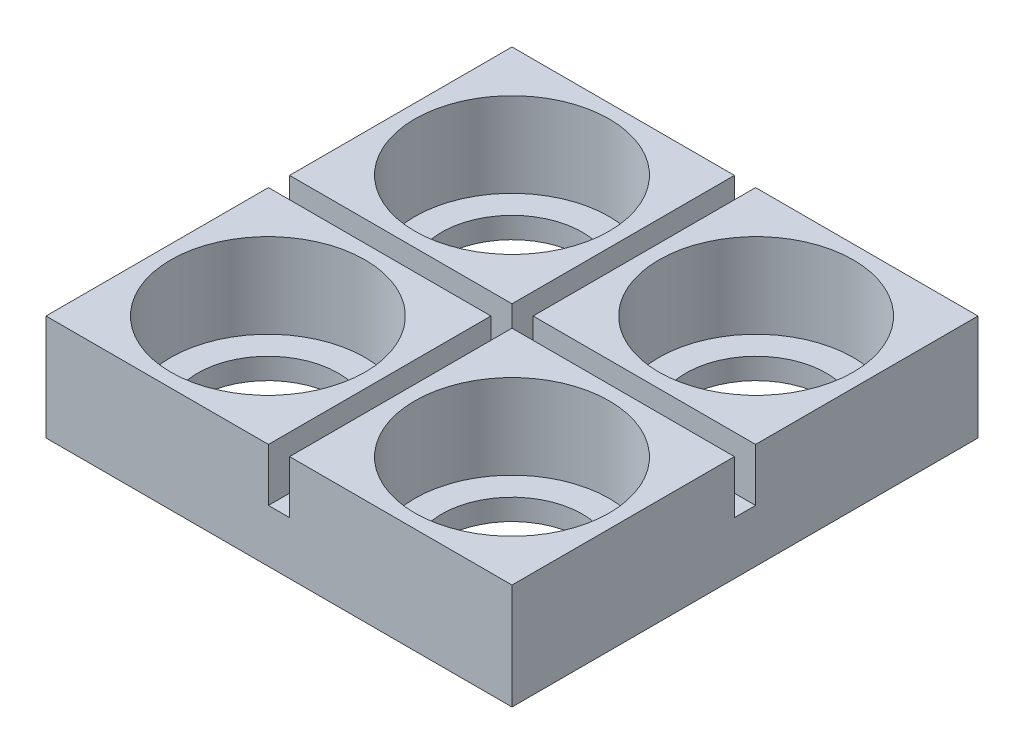
ISO-10303-21;
HEADER;
FILE_DESCRIPTION(('STEP AP214'),'2;1');
FILE_NAME('part.step','',(''),(''),'','','');
FILE_SCHEMA(('AUTOMOTIVE_DESIGN { 1 0 10303 214 1 1 1 1 }'));
ENDSEC;
DATA;
#1=APPLICATION_CONTEXT('core data for automotive mechanical design processes');
#2=APPLICATION_PROTOCOL_DEFINITION('international standard','automotive_design',2000,#1);
#3=PRODUCT_CONTEXT('',#1,'mechanical');
#4=PRODUCT('Part','Part','',(#3));
#5=PRODUCT_RELATED_PRODUCT_CATEGORY('part','',(#4));
#6=PRODUCT_DEFINITION_FORMATION('','',#4);
#7=PRODUCT_DEFINITION_CONTEXT('part definition',#1,'design');
#8=PRODUCT_DEFINITION('design','',#6,#7);
#9=PRODUCT_DEFINITION_SHAPE('','',#8);
#10=(LENGTH_UNIT() NAMED_UNIT(*) SI_UNIT(.MILLI.,.METRE.));
#11=(NAMED_UNIT(*) PLANE_ANGLE_UNIT() SI_UNIT($,.RADIAN.));
#12=(NAMED_UNIT(*) SI_UNIT($,.STERADIAN.) SOLID_ANGLE_UNIT());
#13=UNCERTAINTY_MEASURE_WITH_UNIT(LENGTH_MEASURE(1.E-05),#10,'distance_accuracy_value','');
#14=(GEOMETRIC_REPRESENTATION_CONTEXT(3) GLOBAL_UNCERTAINTY_ASSIGNED_CONTEXT((#13)) GLOBAL_UNIT_ASSIGNED_CONTEXT((#10,
#11,#12)) REPRESENTATION_CONTEXT('',''));
#15=CARTESIAN_POINT('',(0.,0.,0.));
#16=DIRECTION('',(0.,0.,1.));
#17=DIRECTION('',(1.,0.,0.));
#18=AXIS2_PLACEMENT_3D('',#15,#16,#17);
#19=CARTESIAN_POINT('',(0.,10.,0.));
#20=DIRECTION('',(0.,1.,0.));
#21=DIRECTION('',(0.,0.,1.));
#22=AXIS2_PLACEMENT_3D('',#19,#20,#21);
#23=PLANE('',#22);
#24=DIRECTION('',(0.,0.,-1.));
#25=VECTOR('',#24,1.);
#26=CARTESIAN_POINT('',(23.05,10.,-22.05));
#27=LINE('',#26,#25);
#28=CARTESIAN_POINT('',(23.05,10.,-1.00000000000001));
#29=VERTEX_POINT('',#28);
#30=CARTESIAN_POINT('',(23.05,10.,-22.05));
#31=VERTEX_POINT('',#30);
#32=EDGE_CURVE('E200',#29,#31,#27,.T.);
#33=ORIENTED_EDGE('',*,*,#32,.F.);
#34=DIRECTION('',(-1.,0.,0.));
#35=VECTOR('',#34,1.);
#36=CARTESIAN_POINT('',(0.,10.,-1.));
#37=LINE('',#36,#35);
#38=CARTESIAN_POINT('',(44.1,10.,-1.00000000000003));
#39=VERTEX_POINT('',#38);
#40=EDGE_CURVE('E13',#39,#29,#37,.T.);
#41=ORIENTED_EDGE('',*,*,#40,.F.);
#42=DIRECTION('',(0.,0.,-1.));
#43=VECTOR('',#42,1.);
#44=CARTESIAN_POINT('',(44.1,10.,-22.05));
#45=LINE('',#44,#43);
#46=CARTESIAN_POINT('',(44.1,10.,-22.05));
#47=VERTEX_POINT('',#46);
#48=EDGE_CURVE('E317',#39,#47,#45,.T.);
#49=ORIENTED_EDGE('',*,*,#48,.T.);
#50=DIRECTION('',(-1.,0.,0.));
#51=VECTOR('',#50,1.);
#52=CARTESIAN_POINT('',(0.,10.,-22.05));
#53=LINE('',#52,#51);
#54=EDGE_CURVE('E321',#47,#31,#53,.T.);
#55=ORIENTED_EDGE('',*,*,#54,.T.);
#56=EDGE_LOOP('',(#33,#41,#49,#55));
#57=FACE_BOUND('',#56,.T.);
#58=CARTESIAN_POINT('',(33.6,10.,-11.55));
#59=DIRECTION('',(0.,-1.,0.));
#60=DIRECTION('',(0.,0.,1.));
#61=AXIS2_PLACEMENT_3D('',#58,#59,#60);
#62=CIRCLE('',#61,9.19999999999999);
#63=CARTESIAN_POINT('',(33.6,10.,-2.35000000000001));
#64=VERTEX_POINT('',#63);
#65=EDGE_CURVE('E279',#64,#64,#62,.T.);
#66=ORIENTED_EDGE('',*,*,#65,.T.);
#67=EDGE_LOOP('',(#66));
#68=FACE_BOUND('',#67,.T.);
#69=ADVANCED_FACE('F55',(#57,#68),#23,.T.);
#70=DIRECTION('',(1.,0.,0.));
#71=VECTOR('',#70,1.);
#72=CARTESIAN_POINT('',(23.05,10.,1.));
#73=LINE('',#72,#71);
#74=CARTESIAN_POINT('',(23.05,10.,1.));
#75=VERTEX_POINT('',#74);
#76=CARTESIAN_POINT('',(44.1,10.,1.));
#77=VERTEX_POINT('',#76);
#78=EDGE_CURVE('E202',#75,#77,#73,.T.);
#79=ORIENTED_EDGE('',*,*,#78,.F.);
#80=DIRECTION('',(0.,0.,-1.));
#81=VECTOR('',#80,1.);
#82=CARTESIAN_POINT('',(23.05,10.,0.));
#83=LINE('',#82,#81);
#84=CARTESIAN_POINT('',(23.05,10.,22.05));
#85=VERTEX_POINT('',#84);
#86=EDGE_CURVE('E63',#85,#75,#83,.T.);
#87=ORIENTED_EDGE('',*,*,#86,.F.);
#88=DIRECTION('',(1.,0.,0.));
#89=VECTOR('',#88,1.);
#90=CARTESIAN_POINT('',(0.,10.,22.05));
#91=LINE('',#90,#89);
#92=CARTESIAN_POINT('',(44.1,10.,22.05));
#93=VERTEX_POINT('',#92);
#94=EDGE_CURVE('E314',#85,#93,#91,.T.);
#95=ORIENTED_EDGE('',*,*,#94,.T.);
#96=EDGE_CURVE('E318',#93,#77,#45,.T.);
#97=ORIENTED_EDGE('',*,*,#96,.T.);
#98=EDGE_LOOP('',(#79,#87,#95,#97));
#99=FACE_BOUND('',#98,.T.);
#100=CARTESIAN_POINT('',(33.6,10.,11.55));
#101=DIRECTION('',(0.,1.,0.));
#102=DIRECTION('',(0.,0.,-1.));
#103=AXIS2_PLACEMENT_3D('',#100,#101,#102);
#104=CIRCLE('',#103,9.19999999999999);
#105=CARTESIAN_POINT('',(33.6,10.,2.35000000000001));
#106=VERTEX_POINT('',#105);
#107=EDGE_CURVE('E273',#106,#106,#104,.T.);
#108=ORIENTED_EDGE('',*,*,#107,.F.);
#109=EDGE_LOOP('',(#108));
#110=FACE_BOUND('',#109,.T.);
#111=ADVANCED_FACE('F351',(#99,#110),#23,.T.);
#112=DIRECTION('',(0.,0.,1.));
#113=VECTOR('',#112,1.);
#114=CARTESIAN_POINT('',(21.05,10.,1.));
#115=LINE('',#114,#113);
#116=CARTESIAN_POINT('',(21.05,10.,1.));
#117=VERTEX_POINT('',#116);
#118=CARTESIAN_POINT('',(21.05,10.,22.05));
#119=VERTEX_POINT('',#118);
#120=EDGE_CURVE('E228',#117,#119,#115,.T.);
#121=ORIENTED_EDGE('',*,*,#120,.F.);
#122=DIRECTION('',(1.,0.,0.));
#123=VECTOR('',#122,1.);
#124=CARTESIAN_POINT('',(0.,10.,1.));
#125=LINE('',#124,#123);
#126=CARTESIAN_POINT('',(0.,10.,1.));
#127=VERTEX_POINT('',#126);
#128=EDGE_CURVE('E225',#127,#117,#125,.T.);
#129=ORIENTED_EDGE('',*,*,#128,.F.);
#130=DIRECTION('',(0.,0.,1.));
#131=VECTOR('',#130,1.);
#132=CARTESIAN_POINT('',(0.,10.,-22.05));
#133=LINE('',#132,#131);
#134=CARTESIAN_POINT('',(0.,10.,22.05));
#135=VERTEX_POINT('',#134);
#136=EDGE_CURVE('E108',#127,#135,#133,.T.);
#137=ORIENTED_EDGE('',*,*,#136,.T.);
#138=EDGE_CURVE('E315',#135,#119,#91,.T.);
#139=ORIENTED_EDGE('',*,*,#138,.T.);
#140=EDGE_LOOP('',(#121,#129,#137,#139));
#141=FACE_BOUND('',#140,.T.);
#142=CARTESIAN_POINT('',(10.5,10.,11.55));
#143=DIRECTION('',(0.,-1.,0.));
#144=DIRECTION('',(0.,0.,-1.));
#145=AXIS2_PLACEMENT_3D('',#142,#143,#144);
#146=CIRCLE('',#145,9.19999999999999);
#147=CARTESIAN_POINT('',(10.5,10.,2.35000000000001));
#148=VERTEX_POINT('',#147);
#149=EDGE_CURVE('E291',#148,#148,#146,.T.);
#150=ORIENTED_EDGE('',*,*,#149,.T.);
#151=EDGE_LOOP('',(#150));
#152=FACE_BOUND('',#151,.T.);
#153=ADVANCED_FACE('F391',(#141,#152),#23,.T.);
#154=CARTESIAN_POINT('',(0.,10.,-22.05));
#155=DIRECTION('',(1.,0.,0.));
#156=DIRECTION('',(0.,0.,-1.));
#157=AXIS2_PLACEMENT_3D('',#154,#155,#156);
#158=PLANE('',#157);
#159=ORIENTED_EDGE('',*,*,#136,.F.);
#160=DIRECTION('',(0.,1.,0.));
#161=VECTOR('',#160,1.);
#162=CARTESIAN_POINT('',(0.,5.,1.));
#163=LINE('',#162,#161);
#164=CARTESIAN_POINT('',(0.,5.,1.));
#165=VERTEX_POINT('',#164);
#166=EDGE_CURVE('E245',#165,#127,#163,.T.);
#167=ORIENTED_EDGE('',*,*,#166,.F.);
#168=DIRECTION('',(0.,0.,1.));
#169=VECTOR('',#168,1.);
#170=CARTESIAN_POINT('',(0.,5.,-1.));
#171=LINE('',#170,#169);
#172=CARTESIAN_POINT('',(0.,5.,-1.));
#173=VERTEX_POINT('',#172);
#174=EDGE_CURVE('E194',#173,#165,#171,.T.);
#175=ORIENTED_EDGE('',*,*,#174,.F.);
#176=DIRECTION('',(0.,1.,0.));
#177=VECTOR('',#176,1.);
#178=CARTESIAN_POINT('',(0.,5.,-1.));
#179=LINE('',#178,#177);
#180=CARTESIAN_POINT('',(0.,10.,-1.));
#181=VERTEX_POINT('',#180);
#182=EDGE_CURVE('E184',#173,#181,#179,.T.);
#183=ORIENTED_EDGE('',*,*,#182,.T.);
#184=CARTESIAN_POINT('',(0.,10.,-22.05));
#185=VERTEX_POINT('',#184);
#186=EDGE_CURVE('E312',#185,#181,#133,.T.);
#187=ORIENTED_EDGE('',*,*,#186,.F.);
#188=DIRECTION('',(0.,-1.,0.));
#189=VECTOR('',#188,1.);
#190=CARTESIAN_POINT('',(0.,10.,-22.05));
#191=LINE('',#190,#189);
#192=CARTESIAN_POINT('',(0.,0.,-22.05));
#193=VERTEX_POINT('',#192);
#194=EDGE_CURVE('E324',#185,#193,#191,.T.);
#195=ORIENTED_EDGE('',*,*,#194,.T.);
#196=DIRECTION('',(0.,0.,1.));
#197=VECTOR('',#196,1.);
#198=CARTESIAN_POINT('',(0.,0.,-22.05));
#199=LINE('',#198,#197);
#200=CARTESIAN_POINT('',(0.,0.,22.05));
#201=VERTEX_POINT('',#200);
#202=EDGE_CURVE('E309',#193,#201,#199,.T.);
#203=ORIENTED_EDGE('',*,*,#202,.T.);
#204=DIRECTION('',(0.,-1.,0.));
#205=VECTOR('',#204,1.);
#206=CARTESIAN_POINT('',(0.,10.,22.05));
#207=LINE('',#206,#205);
#208=EDGE_CURVE('E338',#135,#201,#207,.T.);
#209=ORIENTED_EDGE('',*,*,#208,.F.);
#210=EDGE_LOOP('',(#159,#167,#175,#183,#187,#195,#203,#209));
#211=FACE_BOUND('',#210,.T.);
#212=ADVANCED_FACE('F57',(#211),#158,.F.);
#213=CARTESIAN_POINT('',(0.,10.,22.05));
#214=DIRECTION('',(0.,0.,-1.));
#215=DIRECTION('',(-1.,0.,0.));
#216=AXIS2_PLACEMENT_3D('',#213,#214,#215);
#217=PLANE('',#216);
#218=ORIENTED_EDGE('',*,*,#94,.F.);
#219=DIRECTION('',(0.,-1.,0.));
#220=VECTOR('',#219,1.);
#221=CARTESIAN_POINT('',(23.05,10.,22.05));
#222=LINE('',#221,#220);
#223=CARTESIAN_POINT('',(23.05,5.,22.05));
#224=VERTEX_POINT('',#223);
#225=EDGE_CURVE('E250',#85,#224,#222,.T.);
#226=ORIENTED_EDGE('',*,*,#225,.T.);
#227=DIRECTION('',(1.,0.,0.));
#228=VECTOR('',#227,1.);
#229=CARTESIAN_POINT('',(0.,5.,22.05));
#230=LINE('',#229,#228);
#231=CARTESIAN_POINT('',(21.05,5.,22.05));
#232=VERTEX_POINT('',#231);
#233=EDGE_CURVE('E261',#232,#224,#230,.T.);
#234=ORIENTED_EDGE('',*,*,#233,.F.);
#235=DIRECTION('',(0.,1.,0.));
#236=VECTOR('',#235,1.);
#237=CARTESIAN_POINT('',(21.05,10.,22.05));
#238=LINE('',#237,#236);
#239=EDGE_CURVE('E233',#232,#119,#238,.T.);
#240=ORIENTED_EDGE('',*,*,#239,.T.);
#241=ORIENTED_EDGE('',*,*,#138,.F.);
#242=ORIENTED_EDGE('',*,*,#208,.T.);
#243=DIRECTION('',(1.,0.,0.));
#244=VECTOR('',#243,1.);
#245=CARTESIAN_POINT('',(0.,0.,22.05));
#246=LINE('',#245,#244);
#247=CARTESIAN_POINT('',(44.1,0.,22.05));
#248=VERTEX_POINT('',#247);
#249=EDGE_CURVE('E327',#201,#248,#246,.T.);
#250=ORIENTED_EDGE('',*,*,#249,.T.);
#251=DIRECTION('',(0.,-1.,0.));
#252=VECTOR('',#251,1.);
#253=CARTESIAN_POINT('',(44.1,10.,22.05));
#254=LINE('',#253,#252);
#255=EDGE_CURVE('E335',#93,#248,#254,.T.);
#256=ORIENTED_EDGE('',*,*,#255,.F.);
#257=EDGE_LOOP('',(#218,#226,#234,#240,#241,#242,#250,#256));
#258=FACE_BOUND('',#257,.T.);
#259=ADVANCED_FACE('F363',(#258),#217,.F.);
#260=CARTESIAN_POINT('',(44.1,10.,-22.05));
#261=DIRECTION('',(-1.,0.,0.));
#262=DIRECTION('',(0.,0.,1.));
#263=AXIS2_PLACEMENT_3D('',#260,#261,#262);
#264=PLANE('',#263);
#265=ORIENTED_EDGE('',*,*,#48,.F.);
#266=DIRECTION('',(0.,-1.,0.));
#267=VECTOR('',#266,1.);
#268=CARTESIAN_POINT('',(44.1,10.,-1.00000000000003));
#269=LINE('',#268,#267);
#270=CARTESIAN_POINT('',(44.1,5.,-1.00000000000003));
#271=VERTEX_POINT('',#270);
#272=EDGE_CURVE('E256',#39,#271,#269,.T.);
#273=ORIENTED_EDGE('',*,*,#272,.T.);
#274=DIRECTION('',(0.,0.,-1.));
#275=VECTOR('',#274,1.);
#276=CARTESIAN_POINT('',(44.1,5.,-22.05));
#277=LINE('',#276,#275);
#278=CARTESIAN_POINT('',(44.1,5.,1.));
#279=VERTEX_POINT('',#278);
#280=EDGE_CURVE('E259',#279,#271,#277,.T.);
#281=ORIENTED_EDGE('',*,*,#280,.F.);
#282=DIRECTION('',(0.,1.,0.));
#283=VECTOR('',#282,1.);
#284=CARTESIAN_POINT('',(44.1,10.,1.));
#285=LINE('',#284,#283);
#286=EDGE_CURVE('E253',#279,#77,#285,.T.);
#287=ORIENTED_EDGE('',*,*,#286,.T.);
#288=ORIENTED_EDGE('',*,*,#96,.F.);
#289=ORIENTED_EDGE('',*,*,#255,.T.);
#290=DIRECTION('',(0.,0.,-1.));
#291=VECTOR('',#290,1.);
#292=CARTESIAN_POINT('',(44.1,0.,-22.05));
#293=LINE('',#292,#291);
#294=CARTESIAN_POINT('',(44.1,0.,-22.05));
#295=VERTEX_POINT('',#294);
#296=EDGE_CURVE('E329',#248,#295,#293,.T.);
#297=ORIENTED_EDGE('',*,*,#296,.T.);
#298=DIRECTION('',(0.,-1.,0.));
#299=VECTOR('',#298,1.);
#300=CARTESIAN_POINT('',(44.1,10.,-22.05));
#301=LINE('',#300,#299);
#302=EDGE_CURVE('E333',#47,#295,#301,.T.);
#303=ORIENTED_EDGE('',*,*,#302,.F.);
#304=EDGE_LOOP('',(#265,#273,#281,#287,#288,#289,#297,#303));
#305=FACE_BOUND('',#304,.T.);
#306=ADVANCED_FACE('F357',(#305),#264,.F.);
#307=CARTESIAN_POINT('',(0.,10.,-22.05));
#308=DIRECTION('',(0.,0.,1.));
#309=DIRECTION('',(1.,0.,0.));
#310=AXIS2_PLACEMENT_3D('',#307,#308,#309);
#311=PLANE('',#310);
#312=CARTESIAN_POINT('',(21.05,10.,-22.05));
#313=VERTEX_POINT('',#312);
#314=EDGE_CURVE('E78',#313,#185,#53,.T.);
#315=ORIENTED_EDGE('',*,*,#314,.F.);
#316=DIRECTION('',(0.,1.,0.));
#317=VECTOR('',#316,1.);
#318=CARTESIAN_POINT('',(21.05,5.,-22.05));
#319=LINE('',#318,#317);
#320=CARTESIAN_POINT('',(21.05,5.,-22.05));
#321=VERTEX_POINT('',#320);
#322=EDGE_CURVE('E231',#321,#313,#319,.T.);
#323=ORIENTED_EDGE('',*,*,#322,.F.);
#324=DIRECTION('',(-1.,0.,0.));
#325=VECTOR('',#324,1.);
#326=CARTESIAN_POINT('',(21.05,5.,-22.05));
#327=LINE('',#326,#325);
#328=CARTESIAN_POINT('',(23.05,5.,-22.05));
#329=VERTEX_POINT('',#328);
#330=EDGE_CURVE('E185',#329,#321,#327,.T.);
#331=ORIENTED_EDGE('',*,*,#330,.F.);
#332=DIRECTION('',(0.,1.,0.));
#333=VECTOR('',#332,1.);
#334=CARTESIAN_POINT('',(23.05,5.,-22.05));
#335=LINE('',#334,#333);
#336=EDGE_CURVE('E234',#329,#31,#335,.T.);
#337=ORIENTED_EDGE('',*,*,#336,.T.);
#338=ORIENTED_EDGE('',*,*,#54,.F.);
#339=ORIENTED_EDGE('',*,*,#302,.T.);
#340=DIRECTION('',(-1.,0.,0.));
#341=VECTOR('',#340,1.);
#342=CARTESIAN_POINT('',(0.,0.,-22.05));
#343=LINE('',#342,#341);
#344=EDGE_CURVE('E100',#295,#193,#343,.T.);
#345=ORIENTED_EDGE('',*,*,#344,.T.);
#346=ORIENTED_EDGE('',*,*,#194,.F.);
#347=EDGE_LOOP('',(#315,#323,#331,#337,#338,#339,#345,#346));
#348=FACE_BOUND('',#347,.T.);
#349=ADVANCED_FACE('F370',(#348),#311,.F.);
#350=DIRECTION('',(0.,0.,1.));
#351=VECTOR('',#350,1.);
#352=CARTESIAN_POINT('',(21.05,10.,-22.05));
#353=LINE('',#352,#351);
#354=CARTESIAN_POINT('',(21.05,10.,-1.00000000000001));
#355=VERTEX_POINT('',#354);
#356=EDGE_CURVE('E70',#313,#355,#353,.T.);
#357=ORIENTED_EDGE('',*,*,#356,.F.);
#358=ORIENTED_EDGE('',*,*,#314,.T.);
#359=ORIENTED_EDGE('',*,*,#186,.T.);
#360=DIRECTION('',(-1.,0.,0.));
#361=VECTOR('',#360,1.);
#362=CARTESIAN_POINT('',(0.,10.,-1.));
#363=LINE('',#362,#361);
#364=EDGE_CURVE('E223',#355,#181,#363,.T.);
#365=ORIENTED_EDGE('',*,*,#364,.F.);
#366=EDGE_LOOP('',(#357,#358,#359,#365));
#367=FACE_BOUND('',#366,.T.);
#368=CARTESIAN_POINT('',(10.5,10.,-11.55));
#369=DIRECTION('',(0.,1.,0.));
#370=DIRECTION('',(0.,0.,1.));
#371=AXIS2_PLACEMENT_3D('',#368,#369,#370);
#372=CIRCLE('',#371,9.19999999999999);
#373=CARTESIAN_POINT('',(10.5,10.,-2.35000000000001));
#374=VERTEX_POINT('',#373);
#375=EDGE_CURVE('E303',#374,#374,#372,.T.);
#376=ORIENTED_EDGE('',*,*,#375,.F.);
#377=EDGE_LOOP('',(#376));
#378=FACE_BOUND('',#377,.T.);
#379=ADVANCED_FACE('F380',(#367,#378),#23,.T.);
#380=CARTESIAN_POINT('',(0.,0.,0.));
#381=DIRECTION('',(0.,1.,0.));
#382=DIRECTION('',(0.,0.,1.));
#383=AXIS2_PLACEMENT_3D('',#380,#381,#382);
#384=PLANE('',#383);
#385=CARTESIAN_POINT('',(33.6,0.,-11.55));
#386=DIRECTION('',(0.,-1.,0.));
#387=DIRECTION('',(0.,0.,1.));
#388=AXIS2_PLACEMENT_3D('',#385,#386,#387);
#389=CIRCLE('',#388,6.65);
#390=CARTESIAN_POINT('',(33.6,0.,-4.9));
#391=VERTEX_POINT('',#390);
#392=EDGE_CURVE('E264',#391,#391,#389,.T.);
#393=ORIENTED_EDGE('',*,*,#392,.F.);
#394=EDGE_LOOP('',(#393));
#395=FACE_BOUND('',#394,.T.);
#396=CARTESIAN_POINT('',(33.6,0.,11.55));
#397=DIRECTION('',(0.,1.,0.));
#398=DIRECTION('',(0.,0.,-1.));
#399=AXIS2_PLACEMENT_3D('',#396,#397,#398);
#400=CIRCLE('',#399,6.65);
#401=CARTESIAN_POINT('',(33.6,0.,4.9));
#402=VERTEX_POINT('',#401);
#403=EDGE_CURVE('E270',#402,#402,#400,.T.);
#404=ORIENTED_EDGE('',*,*,#403,.T.);
#405=EDGE_LOOP('',(#404));
#406=FACE_BOUND('',#405,.T.);
#407=CARTESIAN_POINT('',(10.5,0.,11.55));
#408=DIRECTION('',(0.,-1.,0.));
#409=DIRECTION('',(0.,0.,-1.));
#410=AXIS2_PLACEMENT_3D('',#407,#408,#409);
#411=CIRCLE('',#410,6.65);
#412=CARTESIAN_POINT('',(10.5,0.,4.9));
#413=VERTEX_POINT('',#412);
#414=EDGE_CURVE('E288',#413,#413,#411,.T.);
#415=ORIENTED_EDGE('',*,*,#414,.F.);
#416=EDGE_LOOP('',(#415));
#417=FACE_BOUND('',#416,.T.);
#418=CARTESIAN_POINT('',(10.5,0.,-11.55));
#419=DIRECTION('',(0.,1.,0.));
#420=DIRECTION('',(0.,0.,1.));
#421=AXIS2_PLACEMENT_3D('',#418,#419,#420);
#422=CIRCLE('',#421,6.65);
#423=CARTESIAN_POINT('',(10.5,0.,-4.9));
#424=VERTEX_POINT('',#423);
#425=EDGE_CURVE('E300',#424,#424,#422,.T.);
#426=ORIENTED_EDGE('',*,*,#425,.T.);
#427=EDGE_LOOP('',(#426));
#428=FACE_BOUND('',#427,.T.);
#429=ORIENTED_EDGE('',*,*,#202,.F.);
#430=ORIENTED_EDGE('',*,*,#344,.F.);
#431=ORIENTED_EDGE('',*,*,#296,.F.);
#432=ORIENTED_EDGE('',*,*,#249,.F.);
#433=EDGE_LOOP('',(#429,#430,#431,#432));
#434=FACE_BOUND('',#433,.T.);
#435=ADVANCED_FACE('F367',(#395,#406,#417,#428,#434),#384,.F.);
#436=CARTESIAN_POINT('',(10.5,2.,-11.55));
#437=DIRECTION('',(0.,1.,0.));
#438=DIRECTION('',(0.,0.,1.));
#439=AXIS2_PLACEMENT_3D('',#436,#437,#438);
#440=CYLINDRICAL_SURFACE('',#439,9.19999999999999);
#441=CARTESIAN_POINT('',(10.5,2.,-11.55));
#442=DIRECTION('',(0.,1.,0.));
#443=DIRECTION('',(0.,0.,1.));
#444=AXIS2_PLACEMENT_3D('',#441,#442,#443);
#445=CIRCLE('',#444,9.19999999999999);
#446=CARTESIAN_POINT('',(10.5,2.,-2.35000000000001));
#447=VERTEX_POINT('',#446);
#448=EDGE_CURVE('E306',#447,#447,#445,.T.);
#449=ORIENTED_EDGE('',*,*,#448,.F.);
#450=EDGE_LOOP('',(#449));
#451=FACE_BOUND('',#450,.T.);
#452=ORIENTED_EDGE('',*,*,#375,.T.);
#453=EDGE_LOOP('',(#452));
#454=FACE_BOUND('',#453,.T.);
#455=ADVANCED_FACE('F428',(#451,#454),#440,.F.);
#456=CARTESIAN_POINT('',(0.,2.,0.));
#457=DIRECTION('',(0.,1.,0.));
#458=DIRECTION('',(0.,0.,1.));
#459=AXIS2_PLACEMENT_3D('',#456,#457,#458);
#460=PLANE('',#459);
#461=CARTESIAN_POINT('',(10.5,2.,-11.55));
#462=DIRECTION('',(0.,1.,0.));
#463=DIRECTION('',(0.,0.,1.));
#464=AXIS2_PLACEMENT_3D('',#461,#462,#463);
#465=CIRCLE('',#464,6.65);
#466=CARTESIAN_POINT('',(10.5,2.,-4.9));
#467=VERTEX_POINT('',#466);
#468=EDGE_CURVE('E297',#467,#467,#465,.T.);
#469=ORIENTED_EDGE('',*,*,#468,.F.);
#470=EDGE_LOOP('',(#469));
#471=FACE_BOUND('',#470,.T.);
#472=ORIENTED_EDGE('',*,*,#448,.T.);
#473=EDGE_LOOP('',(#472));
#474=FACE_BOUND('',#473,.T.);
#475=ADVANCED_FACE('F412',(#471,#474),#460,.T.);
#476=CARTESIAN_POINT('',(10.5,0.,-11.55));
#477=DIRECTION('',(0.,1.,0.));
#478=DIRECTION('',(0.,0.,1.));
#479=AXIS2_PLACEMENT_3D('',#476,#477,#478);
#480=CYLINDRICAL_SURFACE('',#479,6.65);
#481=ORIENTED_EDGE('',*,*,#425,.F.);
#482=EDGE_LOOP('',(#481));
#483=FACE_BOUND('',#482,.T.);
#484=ORIENTED_EDGE('',*,*,#468,.T.);
#485=EDGE_LOOP('',(#484));
#486=FACE_BOUND('',#485,.T.);
#487=ADVANCED_FACE('F400',(#483,#486),#480,.F.);
#488=CARTESIAN_POINT('',(10.5,2.,11.55));
#489=DIRECTION('',(0.,1.,0.));
#490=DIRECTION('',(0.,0.,1.));
#491=AXIS2_PLACEMENT_3D('',#488,#489,#490);
#492=CYLINDRICAL_SURFACE('',#491,9.19999999999999);
#493=CARTESIAN_POINT('',(10.5,2.,11.55));
#494=DIRECTION('',(0.,-1.,0.));
#495=DIRECTION('',(0.,0.,-1.));
#496=AXIS2_PLACEMENT_3D('',#493,#494,#495);
#497=CIRCLE('',#496,9.19999999999999);
#498=CARTESIAN_POINT('',(10.5,2.,2.35000000000001));
#499=VERTEX_POINT('',#498);
#500=EDGE_CURVE('E294',#499,#499,#497,.T.);
#501=ORIENTED_EDGE('',*,*,#500,.T.);
#502=EDGE_LOOP('',(#501));
#503=FACE_BOUND('',#502,.T.);
#504=ORIENTED_EDGE('',*,*,#149,.F.);
#505=EDGE_LOOP('',(#504));
#506=FACE_BOUND('',#505,.T.);
#507=ADVANCED_FACE('F397',(#503,#506),#492,.F.);
#508=CARTESIAN_POINT('',(0.,2.,0.));
#509=DIRECTION('',(0.,1.,0.));
#510=DIRECTION('',(0.,0.,-1.));
#511=AXIS2_PLACEMENT_3D('',#508,#509,#510);
#512=PLANE('',#511);
#513=CARTESIAN_POINT('',(10.5,2.,11.55));
#514=DIRECTION('',(0.,-1.,0.));
#515=DIRECTION('',(0.,0.,-1.));
#516=AXIS2_PLACEMENT_3D('',#513,#514,#515);
#517=CIRCLE('',#516,6.65);
#518=CARTESIAN_POINT('',(10.5,2.,4.9));
#519=VERTEX_POINT('',#518);
#520=EDGE_CURVE('E285',#519,#519,#517,.T.);
#521=ORIENTED_EDGE('',*,*,#520,.T.);
#522=EDGE_LOOP('',(#521));
#523=FACE_BOUND('',#522,.T.);
#524=ORIENTED_EDGE('',*,*,#500,.F.);
#525=EDGE_LOOP('',(#524));
#526=FACE_BOUND('',#525,.T.);
#527=ADVANCED_FACE('F399',(#523,#526),#512,.T.);
#528=CARTESIAN_POINT('',(10.5,0.,11.55));
#529=DIRECTION('',(0.,1.,0.));
#530=DIRECTION('',(0.,0.,1.));
#531=AXIS2_PLACEMENT_3D('',#528,#529,#530);
#532=CYLINDRICAL_SURFACE('',#531,6.65);
#533=ORIENTED_EDGE('',*,*,#414,.T.);
#534=EDGE_LOOP('',(#533));
#535=FACE_BOUND('',#534,.T.);
#536=ORIENTED_EDGE('',*,*,#520,.F.);
#537=EDGE_LOOP('',(#536));
#538=FACE_BOUND('',#537,.T.);
#539=ADVANCED_FACE('F408',(#535,#538),#532,.F.);
#540=CARTESIAN_POINT('',(33.6,2.,-11.55));
#541=DIRECTION('',(0.,1.,0.));
#542=DIRECTION('',(0.,0.,1.));
#543=AXIS2_PLACEMENT_3D('',#540,#541,#542);
#544=CYLINDRICAL_SURFACE('',#543,9.19999999999999);
#545=CARTESIAN_POINT('',(33.6,2.,-11.55));
#546=DIRECTION('',(0.,-1.,0.));
#547=DIRECTION('',(0.,0.,1.));
#548=AXIS2_PLACEMENT_3D('',#545,#546,#547);
#549=CIRCLE('',#548,9.19999999999999);
#550=CARTESIAN_POINT('',(33.6,2.,-2.35000000000001));
#551=VERTEX_POINT('',#550);
#552=EDGE_CURVE('E282',#551,#551,#549,.T.);
#553=ORIENTED_EDGE('',*,*,#552,.T.);
#554=EDGE_LOOP('',(#553));
#555=FACE_BOUND('',#554,.T.);
#556=ORIENTED_EDGE('',*,*,#65,.F.);
#557=EDGE_LOOP('',(#556));
#558=FACE_BOUND('',#557,.T.);
#559=ADVANCED_FACE('F512',(#555,#558),#544,.F.);
#560=CARTESIAN_POINT('',(44.1,2.,0.));
#561=DIRECTION('',(0.,1.,0.));
#562=DIRECTION('',(0.,0.,1.));
#563=AXIS2_PLACEMENT_3D('',#560,#561,#562);
#564=PLANE('',#563);
#565=CARTESIAN_POINT('',(33.6,2.,-11.55));
#566=DIRECTION('',(0.,-1.,0.));
#567=DIRECTION('',(0.,0.,1.));
#568=AXIS2_PLACEMENT_3D('',#565,#566,#567);
#569=CIRCLE('',#568,6.65);
#570=CARTESIAN_POINT('',(33.6,2.,-4.9));
#571=VERTEX_POINT('',#570);
#572=EDGE_CURVE('E263',#571,#571,#569,.T.);
#573=ORIENTED_EDGE('',*,*,#572,.T.);
#574=EDGE_LOOP('',(#573));
#575=FACE_BOUND('',#574,.T.);
#576=ORIENTED_EDGE('',*,*,#552,.F.);
#577=EDGE_LOOP('',(#576));
#578=FACE_BOUND('',#577,.T.);
#579=ADVANCED_FACE('F501',(#575,#578),#564,.T.);
#580=CARTESIAN_POINT('',(33.6,2.,11.55));
#581=DIRECTION('',(0.,1.,0.));
#582=DIRECTION('',(0.,0.,1.));
#583=AXIS2_PLACEMENT_3D('',#580,#581,#582);
#584=CYLINDRICAL_SURFACE('',#583,9.19999999999999);
#585=CARTESIAN_POINT('',(33.6,2.,11.55));
#586=DIRECTION('',(0.,1.,0.));
#587=DIRECTION('',(0.,0.,-1.));
#588=AXIS2_PLACEMENT_3D('',#585,#586,#587);
#589=CIRCLE('',#588,9.19999999999999);
#590=CARTESIAN_POINT('',(33.6,2.,2.35000000000001));
#591=VERTEX_POINT('',#590);
#592=EDGE_CURVE('E276',#591,#591,#589,.T.);
#593=ORIENTED_EDGE('',*,*,#592,.F.);
#594=EDGE_LOOP('',(#593));
#595=FACE_BOUND('',#594,.T.);
#596=ORIENTED_EDGE('',*,*,#107,.T.);
#597=EDGE_LOOP('',(#596));
#598=FACE_BOUND('',#597,.T.);
#599=ADVANCED_FACE('F491',(#595,#598),#584,.F.);
#600=CARTESIAN_POINT('',(44.1,2.,0.));
#601=DIRECTION('',(0.,1.,0.));
#602=DIRECTION('',(0.,0.,-1.));
#603=AXIS2_PLACEMENT_3D('',#600,#601,#602);
#604=PLANE('',#603);
#605=CARTESIAN_POINT('',(33.6,2.,11.55));
#606=DIRECTION('',(0.,1.,0.));
#607=DIRECTION('',(0.,0.,-1.));
#608=AXIS2_PLACEMENT_3D('',#605,#606,#607);
#609=CIRCLE('',#608,6.65);
#610=CARTESIAN_POINT('',(33.6,2.,4.9));
#611=VERTEX_POINT('',#610);
#612=EDGE_CURVE('E267',#611,#611,#609,.T.);
#613=ORIENTED_EDGE('',*,*,#612,.F.);
#614=EDGE_LOOP('',(#613));
#615=FACE_BOUND('',#614,.T.);
#616=ORIENTED_EDGE('',*,*,#592,.T.);
#617=EDGE_LOOP('',(#616));
#618=FACE_BOUND('',#617,.T.);
#619=ADVANCED_FACE('F480',(#615,#618),#604,.T.);
#620=CARTESIAN_POINT('',(33.6,0.,11.55));
#621=DIRECTION('',(0.,1.,0.));
#622=DIRECTION('',(0.,0.,1.));
#623=AXIS2_PLACEMENT_3D('',#620,#621,#622);
#624=CYLINDRICAL_SURFACE('',#623,6.65);
#625=ORIENTED_EDGE('',*,*,#403,.F.);
#626=EDGE_LOOP('',(#625));
#627=FACE_BOUND('',#626,.T.);
#628=ORIENTED_EDGE('',*,*,#612,.T.);
#629=EDGE_LOOP('',(#628));
#630=FACE_BOUND('',#629,.T.);
#631=ADVANCED_FACE('F469',(#627,#630),#624,.F.);
#632=CARTESIAN_POINT('',(33.6,0.,-11.55));
#633=DIRECTION('',(0.,1.,0.));
#634=DIRECTION('',(0.,0.,1.));
#635=AXIS2_PLACEMENT_3D('',#632,#633,#634);
#636=CYLINDRICAL_SURFACE('',#635,6.65);
#637=ORIENTED_EDGE('',*,*,#392,.T.);
#638=EDGE_LOOP('',(#637));
#639=FACE_BOUND('',#638,.T.);
#640=ORIENTED_EDGE('',*,*,#572,.F.);
#641=EDGE_LOOP('',(#640));
#642=FACE_BOUND('',#641,.T.);
#643=ADVANCED_FACE('F465',(#639,#642),#636,.F.);
#644=CARTESIAN_POINT('',(0.,5.,0.));
#645=DIRECTION('',(0.,1.,0.));
#646=DIRECTION('',(0.,0.,1.));
#647=AXIS2_PLACEMENT_3D('',#644,#645,#646);
#648=PLANE('',#647);
#649=ORIENTED_EDGE('',*,*,#233,.T.);
#650=DIRECTION('',(0.,0.,-1.));
#651=VECTOR('',#650,1.);
#652=CARTESIAN_POINT('',(23.05,5.,1.));
#653=LINE('',#652,#651);
#654=CARTESIAN_POINT('',(23.05,5.,1.));
#655=VERTEX_POINT('',#654);
#656=EDGE_CURVE('E212',#224,#655,#653,.T.);
#657=ORIENTED_EDGE('',*,*,#656,.T.);
#658=DIRECTION('',(1.,0.,0.));
#659=VECTOR('',#658,1.);
#660=CARTESIAN_POINT('',(23.05,5.,1.));
#661=LINE('',#660,#659);
#662=EDGE_CURVE('E214',#655,#279,#661,.T.);
#663=ORIENTED_EDGE('',*,*,#662,.T.);
#664=ORIENTED_EDGE('',*,*,#280,.T.);
#665=DIRECTION('',(-1.,0.,0.));
#666=VECTOR('',#665,1.);
#667=CARTESIAN_POINT('',(23.05,5.,-1.00000000000001));
#668=LINE('',#667,#666);
#669=CARTESIAN_POINT('',(23.05,5.,-1.00000000000001));
#670=VERTEX_POINT('',#669);
#671=EDGE_CURVE('E217',#271,#670,#668,.T.);
#672=ORIENTED_EDGE('',*,*,#671,.T.);
#673=DIRECTION('',(0.,0.,-1.));
#674=VECTOR('',#673,1.);
#675=CARTESIAN_POINT('',(23.05,5.,-22.05));
#676=LINE('',#675,#674);
#677=EDGE_CURVE('E219',#670,#329,#676,.T.);
#678=ORIENTED_EDGE('',*,*,#677,.T.);
#679=ORIENTED_EDGE('',*,*,#330,.T.);
#680=DIRECTION('',(0.,0.,1.));
#681=VECTOR('',#680,1.);
#682=CARTESIAN_POINT('',(21.05,5.,-22.05));
#683=LINE('',#682,#681);
#684=CARTESIAN_POINT('',(21.05,5.,-1.00000000000001));
#685=VERTEX_POINT('',#684);
#686=EDGE_CURVE('E180',#321,#685,#683,.T.);
#687=ORIENTED_EDGE('',*,*,#686,.T.);
#688=DIRECTION('',(-1.,0.,0.));
#689=VECTOR('',#688,1.);
#690=CARTESIAN_POINT('',(0.,5.,-1.));
#691=LINE('',#690,#689);
#692=EDGE_CURVE('E188',#685,#173,#691,.T.);
#693=ORIENTED_EDGE('',*,*,#692,.T.);
#694=ORIENTED_EDGE('',*,*,#174,.T.);
#695=DIRECTION('',(1.,0.,0.));
#696=VECTOR('',#695,1.);
#697=CARTESIAN_POINT('',(0.,5.,1.));
#698=LINE('',#697,#696);
#699=CARTESIAN_POINT('',(21.05,5.,1.));
#700=VERTEX_POINT('',#699);
#701=EDGE_CURVE('E206',#165,#700,#698,.T.);
#702=ORIENTED_EDGE('',*,*,#701,.T.);
#703=DIRECTION('',(0.,0.,1.));
#704=VECTOR('',#703,1.);
#705=CARTESIAN_POINT('',(21.05,5.,1.));
#706=LINE('',#705,#704);
#707=EDGE_CURVE('E209',#700,#232,#706,.T.);
#708=ORIENTED_EDGE('',*,*,#707,.T.);
#709=EDGE_LOOP('',(#649,#657,#663,#664,#672,#678,#679,#687,#693,#694,#702,#708));
#710=FACE_BOUND('',#709,.T.);
#711=ADVANCED_FACE('F196',(#710),#648,.T.);
#712=CARTESIAN_POINT('',(23.05,5.,-1.00000000000001));
#713=DIRECTION('',(0.,0.,-1.));
#714=DIRECTION('',(-1.,0.,0.));
#715=AXIS2_PLACEMENT_3D('',#712,#713,#714);
#716=PLANE('',#715);
#717=ORIENTED_EDGE('',*,*,#40,.T.);
#718=DIRECTION('',(0.,1.,0.));
#719=VECTOR('',#718,1.);
#720=CARTESIAN_POINT('',(23.05,5.,-1.00000000000001));
#721=LINE('',#720,#719);
#722=EDGE_CURVE('E237',#670,#29,#721,.T.);
#723=ORIENTED_EDGE('',*,*,#722,.F.);
#724=ORIENTED_EDGE('',*,*,#671,.F.);
#725=ORIENTED_EDGE('',*,*,#272,.F.);
#726=EDGE_LOOP('',(#717,#723,#724,#725));
#727=FACE_BOUND('',#726,.T.);
#728=ADVANCED_FACE('F376',(#727),#716,.F.);
#729=CARTESIAN_POINT('',(23.05,5.,1.));
#730=DIRECTION('',(0.,0.,1.));
#731=DIRECTION('',(1.,0.,0.));
#732=AXIS2_PLACEMENT_3D('',#729,#730,#731);
#733=PLANE('',#732);
#734=ORIENTED_EDGE('',*,*,#662,.F.);
#735=DIRECTION('',(0.,1.,0.));
#736=VECTOR('',#735,1.);
#737=CARTESIAN_POINT('',(23.05,5.,1.));
#738=LINE('',#737,#736);
#739=EDGE_CURVE('E240',#655,#75,#738,.T.);
#740=ORIENTED_EDGE('',*,*,#739,.T.);
#741=ORIENTED_EDGE('',*,*,#78,.T.);
#742=ORIENTED_EDGE('',*,*,#286,.F.);
#743=EDGE_LOOP('',(#734,#740,#741,#742));
#744=FACE_BOUND('',#743,.T.);
#745=ADVANCED_FACE('F350',(#744),#733,.F.);
#746=CARTESIAN_POINT('',(23.05,5.,1.));
#747=DIRECTION('',(1.,0.,0.));
#748=DIRECTION('',(0.,0.,-1.));
#749=AXIS2_PLACEMENT_3D('',#746,#747,#748);
#750=PLANE('',#749);
#751=ORIENTED_EDGE('',*,*,#86,.T.);
#752=ORIENTED_EDGE('',*,*,#739,.F.);
#753=ORIENTED_EDGE('',*,*,#656,.F.);
#754=ORIENTED_EDGE('',*,*,#225,.F.);
#755=EDGE_LOOP('',(#751,#752,#753,#754));
#756=FACE_BOUND('',#755,.T.);
#757=ADVANCED_FACE('F343',(#756),#750,.F.);
#758=CARTESIAN_POINT('',(21.05,5.,1.));
#759=DIRECTION('',(-1.,0.,0.));
#760=DIRECTION('',(0.,0.,1.));
#761=AXIS2_PLACEMENT_3D('',#758,#759,#760);
#762=PLANE('',#761);
#763=ORIENTED_EDGE('',*,*,#707,.F.);
#764=DIRECTION('',(0.,1.,0.));
#765=VECTOR('',#764,1.);
#766=CARTESIAN_POINT('',(21.05,5.,1.));
#767=LINE('',#766,#765);
#768=EDGE_CURVE('E243',#700,#117,#767,.T.);
#769=ORIENTED_EDGE('',*,*,#768,.T.);
#770=ORIENTED_EDGE('',*,*,#120,.T.);
#771=ORIENTED_EDGE('',*,*,#239,.F.);
#772=EDGE_LOOP('',(#763,#769,#770,#771));
#773=FACE_BOUND('',#772,.T.);
#774=ADVANCED_FACE('F390',(#773),#762,.F.);
#775=CARTESIAN_POINT('',(21.05,5.,-22.05));
#776=DIRECTION('',(-1.,0.,0.));
#777=DIRECTION('',(0.,0.,1.));
#778=AXIS2_PLACEMENT_3D('',#775,#776,#777);
#779=PLANE('',#778);
#780=ORIENTED_EDGE('',*,*,#356,.T.);
#781=DIRECTION('',(0.,1.,0.));
#782=VECTOR('',#781,1.);
#783=CARTESIAN_POINT('',(21.05,5.,-1.00000000000001));
#784=LINE('',#783,#782);
#785=EDGE_CURVE('E176',#685,#355,#784,.T.);
#786=ORIENTED_EDGE('',*,*,#785,.F.);
#787=ORIENTED_EDGE('',*,*,#686,.F.);
#788=ORIENTED_EDGE('',*,*,#322,.T.);
#789=EDGE_LOOP('',(#780,#786,#787,#788));
#790=FACE_BOUND('',#789,.T.);
#791=ADVANCED_FACE('F178',(#790),#779,.F.);
#792=CARTESIAN_POINT('',(23.05,5.,-22.05));
#793=DIRECTION('',(1.,0.,0.));
#794=DIRECTION('',(0.,0.,-1.));
#795=AXIS2_PLACEMENT_3D('',#792,#793,#794);
#796=PLANE('',#795);
#797=ORIENTED_EDGE('',*,*,#32,.T.);
#798=ORIENTED_EDGE('',*,*,#336,.F.);
#799=ORIENTED_EDGE('',*,*,#677,.F.);
#800=ORIENTED_EDGE('',*,*,#722,.T.);
#801=EDGE_LOOP('',(#797,#798,#799,#800));
#802=FACE_BOUND('',#801,.T.);
#803=ADVANCED_FACE('F671',(#802),#796,.F.);
#804=CARTESIAN_POINT('',(0.,5.,1.));
#805=DIRECTION('',(0.,0.,1.));
#806=DIRECTION('',(1.,0.,0.));
#807=AXIS2_PLACEMENT_3D('',#804,#805,#806);
#808=PLANE('',#807);
#809=ORIENTED_EDGE('',*,*,#128,.T.);
#810=ORIENTED_EDGE('',*,*,#768,.F.);
#811=ORIENTED_EDGE('',*,*,#701,.F.);
#812=ORIENTED_EDGE('',*,*,#166,.T.);
#813=EDGE_LOOP('',(#809,#810,#811,#812));
#814=FACE_BOUND('',#813,.T.);
#815=ADVANCED_FACE('F387',(#814),#808,.F.);
#816=CARTESIAN_POINT('',(0.,5.,-1.));
#817=DIRECTION('',(0.,0.,-1.));
#818=DIRECTION('',(-1.,0.,0.));
#819=AXIS2_PLACEMENT_3D('',#816,#817,#818);
#820=PLANE('',#819);
#821=ORIENTED_EDGE('',*,*,#364,.T.);
#822=ORIENTED_EDGE('',*,*,#182,.F.);
#823=ORIENTED_EDGE('',*,*,#692,.F.);
#824=ORIENTED_EDGE('',*,*,#785,.T.);
#825=EDGE_LOOP('',(#821,#822,#823,#824));
#826=FACE_BOUND('',#825,.T.);
#827=ADVANCED_FACE('F189',(#826),#820,.F.);
#828=CLOSED_SHELL('',(#69,#111,#153,#212,#259,#306,#349,#379,#435,#455,#475,#487,#507,#527,#539,
#559,#579,#599,#619,#631,#643,#711,#728,#745,#757,#774,#791,#803,#815,#827));
#829=MANIFOLD_SOLID_BREP('B2',#828);
#830=ADVANCED_BREP_SHAPE_REPRESENTATION('',(#18,#829),#14);
#831=SHAPE_DEFINITION_REPRESENTATION(#9,#830);
ENDSEC;
END-ISO-10303-21;
